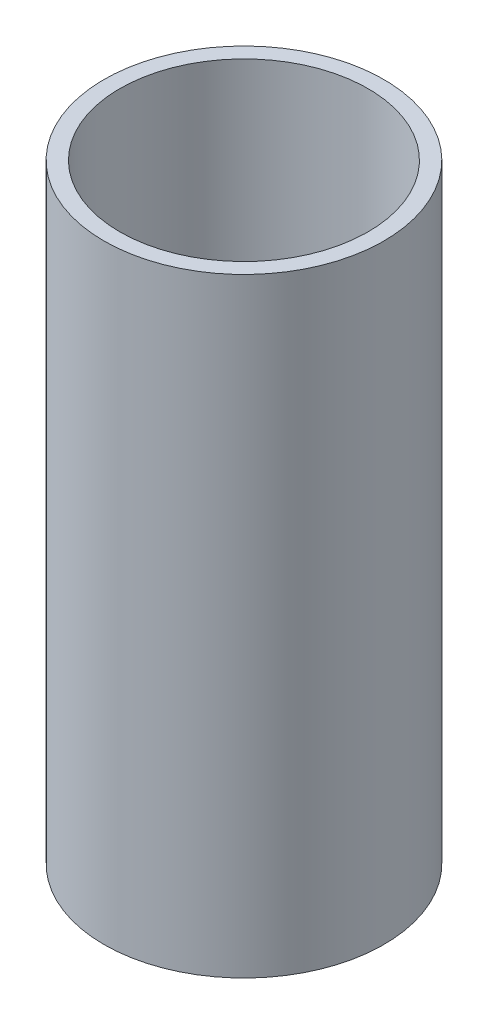
ISO-10303-21;
HEADER;
FILE_DESCRIPTION(('STEP AP214'),'2;1');
FILE_NAME('part.step','',(''),(''),'','','');
FILE_SCHEMA(('AUTOMOTIVE_DESIGN { 1 0 10303 214 1 1 1 1 }'));
ENDSEC;
DATA;
#1=APPLICATION_CONTEXT('core data for automotive mechanical design processes');
#2=APPLICATION_PROTOCOL_DEFINITION('international standard','automotive_design',2000,#1);
#3=PRODUCT_CONTEXT('',#1,'mechanical');
#4=PRODUCT('Part','Part','',(#3));
#5=PRODUCT_RELATED_PRODUCT_CATEGORY('part','',(#4));
#6=PRODUCT_DEFINITION_FORMATION('','',#4);
#7=PRODUCT_DEFINITION_CONTEXT('part definition',#1,'design');
#8=PRODUCT_DEFINITION('design','',#6,#7);
#9=PRODUCT_DEFINITION_SHAPE('','',#8);
#10=(LENGTH_UNIT() NAMED_UNIT(*) SI_UNIT(.MILLI.,.METRE.));
#11=(NAMED_UNIT(*) PLANE_ANGLE_UNIT() SI_UNIT($,.RADIAN.));
#12=(NAMED_UNIT(*) SI_UNIT($,.STERADIAN.) SOLID_ANGLE_UNIT());
#13=UNCERTAINTY_MEASURE_WITH_UNIT(LENGTH_MEASURE(1.E-05),#10,'distance_accuracy_value','');
#14=(GEOMETRIC_REPRESENTATION_CONTEXT(3) GLOBAL_UNCERTAINTY_ASSIGNED_CONTEXT((#13)) GLOBAL_UNIT_ASSIGNED_CONTEXT((#10,
#11,#12)) REPRESENTATION_CONTEXT('',''));
#15=CARTESIAN_POINT('',(0.,0.,0.));
#16=DIRECTION('',(0.,0.,1.));
#17=DIRECTION('',(1.,0.,0.));
#18=AXIS2_PLACEMENT_3D('',#15,#16,#17);
#19=CARTESIAN_POINT('',(0.,67.5,0.));
#20=DIRECTION('',(0.,1.,0.));
#21=DIRECTION('',(0.,0.,1.));
#22=AXIS2_PLACEMENT_3D('',#19,#20,#21);
#23=PLANE('',#22);
#24=CARTESIAN_POINT('',(0.,67.5,0.));
#25=DIRECTION('',(0.,1.,0.));
#26=DIRECTION('',(0.,0.,1.));
#27=AXIS2_PLACEMENT_3D('',#24,#25,#26);
#28=CIRCLE('',#27,31.);
#29=CARTESIAN_POINT('',(0.,67.5,31.));
#30=VERTEX_POINT('',#29);
#31=EDGE_CURVE('E10',#30,#30,#28,.T.);
#32=ORIENTED_EDGE('',*,*,#31,.T.);
#33=EDGE_LOOP('',(#32));
#34=FACE_BOUND('',#33,.T.);
#35=CARTESIAN_POINT('',(0.,67.5,0.));
#36=DIRECTION('',(0.,1.,0.));
#37=DIRECTION('',(0.,0.,1.));
#38=AXIS2_PLACEMENT_3D('',#35,#36,#37);
#39=CIRCLE('',#38,27.5);
#40=CARTESIAN_POINT('',(0.,67.5,27.5));
#41=VERTEX_POINT('',#40);
#42=EDGE_CURVE('E46',#41,#41,#39,.T.);
#43=ORIENTED_EDGE('',*,*,#42,.F.);
#44=EDGE_LOOP('',(#43));
#45=FACE_BOUND('',#44,.T.);
#46=ADVANCED_FACE('F35',(#34,#45),#23,.T.);
#47=CARTESIAN_POINT('',(0.,-67.5,0.));
#48=DIRECTION('',(0.,1.,0.));
#49=DIRECTION('',(0.,0.,1.));
#50=AXIS2_PLACEMENT_3D('',#47,#48,#49);
#51=PLANE('',#50);
#52=CARTESIAN_POINT('',(0.,-67.5,0.));
#53=DIRECTION('',(0.,1.,0.));
#54=DIRECTION('',(0.,0.,1.));
#55=AXIS2_PLACEMENT_3D('',#52,#53,#54);
#56=CIRCLE('',#55,31.);
#57=CARTESIAN_POINT('',(0.,-67.5,31.));
#58=VERTEX_POINT('',#57);
#59=EDGE_CURVE('E39',#58,#58,#56,.T.);
#60=ORIENTED_EDGE('',*,*,#59,.F.);
#61=EDGE_LOOP('',(#60));
#62=FACE_BOUND('',#61,.T.);
#63=CARTESIAN_POINT('',(0.,-67.5,0.));
#64=DIRECTION('',(0.,1.,0.));
#65=DIRECTION('',(0.,0.,1.));
#66=AXIS2_PLACEMENT_3D('',#63,#64,#65);
#67=CIRCLE('',#66,27.5);
#68=CARTESIAN_POINT('',(0.,-67.5,27.5));
#69=VERTEX_POINT('',#68);
#70=EDGE_CURVE('E48',#69,#69,#67,.T.);
#71=ORIENTED_EDGE('',*,*,#70,.T.);
#72=EDGE_LOOP('',(#71));
#73=FACE_BOUND('',#72,.T.);
#74=ADVANCED_FACE('F58',(#62,#73),#51,.F.);
#75=CARTESIAN_POINT('',(0.,67.5,0.));
#76=DIRECTION('',(0.,-1.,0.));
#77=DIRECTION('',(0.,0.,-1.));
#78=AXIS2_PLACEMENT_3D('',#75,#76,#77);
#79=CYLINDRICAL_SURFACE('',#78,31.);
#80=ORIENTED_EDGE('',*,*,#31,.F.);
#81=EDGE_LOOP('',(#80));
#82=FACE_BOUND('',#81,.T.);
#83=ORIENTED_EDGE('',*,*,#59,.T.);
#84=EDGE_LOOP('',(#83));
#85=FACE_BOUND('',#84,.T.);
#86=ADVANCED_FACE('F37',(#82,#85),#79,.T.);
#87=CARTESIAN_POINT('',(0.,67.5,0.));
#88=DIRECTION('',(0.,-1.,0.));
#89=DIRECTION('',(0.,0.,-1.));
#90=AXIS2_PLACEMENT_3D('',#87,#88,#89);
#91=CYLINDRICAL_SURFACE('',#90,27.5);
#92=ORIENTED_EDGE('',*,*,#42,.T.);
#93=EDGE_LOOP('',(#92));
#94=FACE_BOUND('',#93,.T.);
#95=ORIENTED_EDGE('',*,*,#70,.F.);
#96=EDGE_LOOP('',(#95));
#97=FACE_BOUND('',#96,.T.);
#98=ADVANCED_FACE('F54',(#94,#97),#91,.F.);
#99=CLOSED_SHELL('',(#46,#74,#86,#98));
#100=MANIFOLD_SOLID_BREP('B2',#99);
#101=ADVANCED_BREP_SHAPE_REPRESENTATION('',(#18,#100),#14);
#102=SHAPE_DEFINITION_REPRESENTATION(#9,#101);
ENDSEC;
END-ISO-10303-21;
